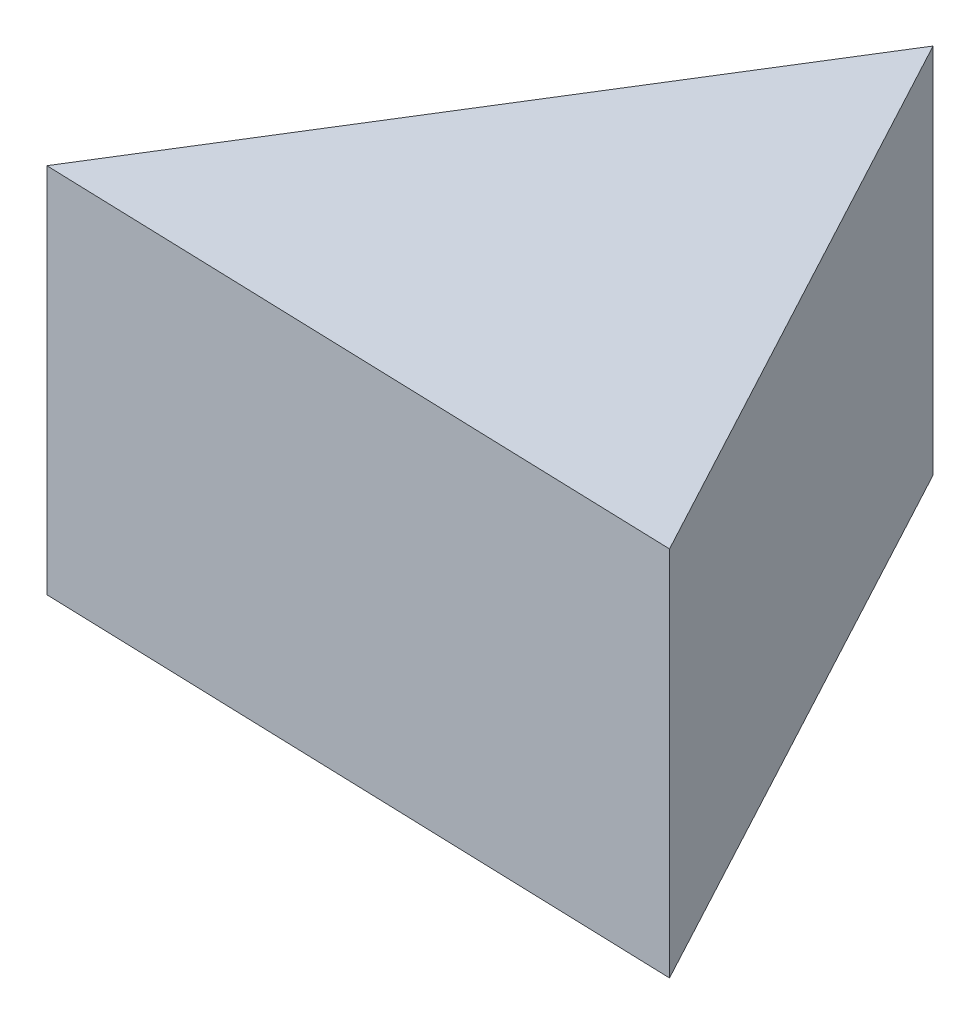
ISO-10303-21;
HEADER;
FILE_DESCRIPTION(('STEP AP214'),'2;1');
FILE_NAME('part.step','',(''),(''),'','','');
FILE_SCHEMA(('AUTOMOTIVE_DESIGN { 1 0 10303 214 1 1 1 1 }'));
ENDSEC;
DATA;
#1=APPLICATION_CONTEXT('core data for automotive mechanical design processes');
#2=APPLICATION_PROTOCOL_DEFINITION('international standard','automotive_design',2000,#1);
#3=PRODUCT_CONTEXT('',#1,'mechanical');
#4=PRODUCT('Part','Part','',(#3));
#5=PRODUCT_RELATED_PRODUCT_CATEGORY('part','',(#4));
#6=PRODUCT_DEFINITION_FORMATION('','',#4);
#7=PRODUCT_DEFINITION_CONTEXT('part definition',#1,'design');
#8=PRODUCT_DEFINITION('design','',#6,#7);
#9=PRODUCT_DEFINITION_SHAPE('','',#8);
#10=(LENGTH_UNIT() NAMED_UNIT(*) SI_UNIT(.MILLI.,.METRE.));
#11=(NAMED_UNIT(*) PLANE_ANGLE_UNIT() SI_UNIT($,.RADIAN.));
#12=(NAMED_UNIT(*) SI_UNIT($,.STERADIAN.) SOLID_ANGLE_UNIT());
#13=UNCERTAINTY_MEASURE_WITH_UNIT(LENGTH_MEASURE(1.E-05),#10,'distance_accuracy_value','');
#14=(GEOMETRIC_REPRESENTATION_CONTEXT(3) GLOBAL_UNCERTAINTY_ASSIGNED_CONTEXT((#13)) GLOBAL_UNIT_ASSIGNED_CONTEXT((#10,
#11,#12)) REPRESENTATION_CONTEXT('',''));
#15=CARTESIAN_POINT('',(0.,0.,0.));
#16=DIRECTION('',(0.,0.,1.));
#17=DIRECTION('',(1.,0.,0.));
#18=AXIS2_PLACEMENT_3D('',#15,#16,#17);
#19=CARTESIAN_POINT('',(-54.2286624896013,-20.,-1.10942163029185));
#20=DIRECTION('',(-0.0320262438446872,0.,0.999487028282609));
#21=DIRECTION('',(0.999487028282609,0.,0.0320262438446872));
#22=AXIS2_PLACEMENT_3D('',#19,#20,#21);
#23=PLANE('',#22);
#24=DIRECTION('',(0.999487028282609,0.,0.0320262438446872));
#25=VECTOR('',#24,1.);
#26=CARTESIAN_POINT('',(-54.2286624896013,0.,-1.10942163029185));
#27=LINE('',#26,#25);
#28=CARTESIAN_POINT('',(-54.2286624896013,0.,-1.10942163029185));
#29=VERTEX_POINT('',#28);
#30=CARTESIAN_POINT('',(-19.6054161997711,0.,0.));
#31=VERTEX_POINT('',#30);
#32=EDGE_CURVE('E97',#29,#31,#27,.T.);
#33=ORIENTED_EDGE('',*,*,#32,.F.);
#34=DIRECTION('',(0.,1.,0.));
#35=VECTOR('',#34,1.);
#36=CARTESIAN_POINT('',(-54.2286624896013,-20.,-1.10942163029185));
#37=LINE('',#36,#35);
#38=CARTESIAN_POINT('',(-54.2286624896013,-20.,-1.10942163029185));
#39=VERTEX_POINT('',#38);
#40=EDGE_CURVE('E11',#39,#29,#37,.T.);
#41=ORIENTED_EDGE('',*,*,#40,.F.);
#42=DIRECTION('',(0.999487028282609,0.,0.0320262438446872));
#43=VECTOR('',#42,1.);
#44=CARTESIAN_POINT('',(-54.2286624896013,-20.,-1.10942163029185));
#45=LINE('',#44,#43);
#46=CARTESIAN_POINT('',(-19.6054161997711,-20.,0.));
#47=VERTEX_POINT('',#46);
#48=EDGE_CURVE('E85',#39,#47,#45,.T.);
#49=ORIENTED_EDGE('',*,*,#48,.T.);
#50=DIRECTION('',(0.,1.,0.));
#51=VECTOR('',#50,1.);
#52=CARTESIAN_POINT('',(-19.6054161997711,-20.,0.));
#53=LINE('',#52,#51);
#54=EDGE_CURVE('E42',#47,#31,#53,.T.);
#55=ORIENTED_EDGE('',*,*,#54,.T.);
#56=EDGE_LOOP('',(#33,#41,#49,#55));
#57=FACE_BOUND('',#56,.T.);
#58=ADVANCED_FACE('F39',(#57),#23,.T.);
#59=CARTESIAN_POINT('',(-35.9562520293456,-20.,-30.5393216636242));
#60=DIRECTION('',(-0.849568035323411,0.,-0.527479054898599));
#61=DIRECTION('',(-0.527479054898599,0.,0.849568035323411));
#62=AXIS2_PLACEMENT_3D('',#59,#60,#61);
#63=PLANE('',#62);
#64=DIRECTION('',(-0.527479054898599,0.,0.849568035323411));
#65=VECTOR('',#64,1.);
#66=CARTESIAN_POINT('',(-35.9562520293456,0.,-30.5393216636242));
#67=LINE('',#66,#65);
#68=CARTESIAN_POINT('',(-35.9562520293456,0.,-30.5393216636242));
#69=VERTEX_POINT('',#68);
#70=EDGE_CURVE('E89',#69,#29,#67,.T.);
#71=ORIENTED_EDGE('',*,*,#70,.F.);
#72=DIRECTION('',(0.,1.,0.));
#73=VECTOR('',#72,1.);
#74=CARTESIAN_POINT('',(-35.9562520293456,-20.,-30.5393216636242));
#75=LINE('',#74,#73);
#76=CARTESIAN_POINT('',(-35.9562520293456,-20.,-30.5393216636242));
#77=VERTEX_POINT('',#76);
#78=EDGE_CURVE('E49',#77,#69,#75,.T.);
#79=ORIENTED_EDGE('',*,*,#78,.F.);
#80=DIRECTION('',(-0.527479054898599,0.,0.849568035323411));
#81=VECTOR('',#80,1.);
#82=CARTESIAN_POINT('',(-35.9562520293456,-20.,-30.5393216636242));
#83=LINE('',#82,#81);
#84=EDGE_CURVE('E82',#77,#39,#83,.T.);
#85=ORIENTED_EDGE('',*,*,#84,.T.);
#86=ORIENTED_EDGE('',*,*,#40,.T.);
#87=EDGE_LOOP('',(#71,#79,#85,#86));
#88=FACE_BOUND('',#87,.T.);
#89=ADVANCED_FACE('F104',(#88),#63,.T.);
#90=CARTESIAN_POINT('',(-19.6054161997711,-20.,0.));
#91=DIRECTION('',(0.881594279168099,0.,-0.47200797338401));
#92=DIRECTION('',(-0.47200797338401,0.,-0.881594279168099));
#93=AXIS2_PLACEMENT_3D('',#90,#91,#92);
#94=PLANE('',#93);
#95=DIRECTION('',(-0.47200797338401,0.,-0.881594279168099));
#96=VECTOR('',#95,1.);
#97=CARTESIAN_POINT('',(-19.6054161997711,0.,0.));
#98=LINE('',#97,#96);
#99=EDGE_CURVE('E79',#31,#69,#98,.T.);
#100=ORIENTED_EDGE('',*,*,#99,.F.);
#101=ORIENTED_EDGE('',*,*,#54,.F.);
#102=DIRECTION('',(-0.47200797338401,0.,-0.881594279168099));
#103=VECTOR('',#102,1.);
#104=CARTESIAN_POINT('',(-19.6054161997711,-20.,0.));
#105=LINE('',#104,#103);
#106=EDGE_CURVE('E77',#47,#77,#105,.T.);
#107=ORIENTED_EDGE('',*,*,#106,.T.);
#108=ORIENTED_EDGE('',*,*,#78,.T.);
#109=EDGE_LOOP('',(#100,#101,#107,#108));
#110=FACE_BOUND('',#109,.T.);
#111=ADVANCED_FACE('F76',(#110),#94,.T.);
#112=CARTESIAN_POINT('',(0.,-20.,0.));
#113=DIRECTION('',(0.,1.,0.));
#114=DIRECTION('',(0.,0.,1.));
#115=AXIS2_PLACEMENT_3D('',#112,#113,#114);
#116=PLANE('',#115);
#117=ORIENTED_EDGE('',*,*,#48,.F.);
#118=ORIENTED_EDGE('',*,*,#84,.F.);
#119=ORIENTED_EDGE('',*,*,#106,.F.);
#120=EDGE_LOOP('',(#117,#118,#119));
#121=FACE_BOUND('',#120,.T.);
#122=ADVANCED_FACE('F84',(#121),#116,.F.);
#123=CARTESIAN_POINT('',(0.,0.,0.));
#124=DIRECTION('',(0.,1.,0.));
#125=DIRECTION('',(0.,0.,1.));
#126=AXIS2_PLACEMENT_3D('',#123,#124,#125);
#127=PLANE('',#126);
#128=ORIENTED_EDGE('',*,*,#32,.T.);
#129=ORIENTED_EDGE('',*,*,#99,.T.);
#130=ORIENTED_EDGE('',*,*,#70,.T.);
#131=EDGE_LOOP('',(#128,#129,#130));
#132=FACE_BOUND('',#131,.T.);
#133=ADVANCED_FACE('F103',(#132),#127,.T.);
#134=CLOSED_SHELL('',(#58,#89,#111,#122,#133));
#135=MANIFOLD_SOLID_BREP('B2',#134);
#136=ADVANCED_BREP_SHAPE_REPRESENTATION('',(#18,#135),#14);
#137=SHAPE_DEFINITION_REPRESENTATION(#9,#136);
ENDSEC;
END-ISO-10303-21;
